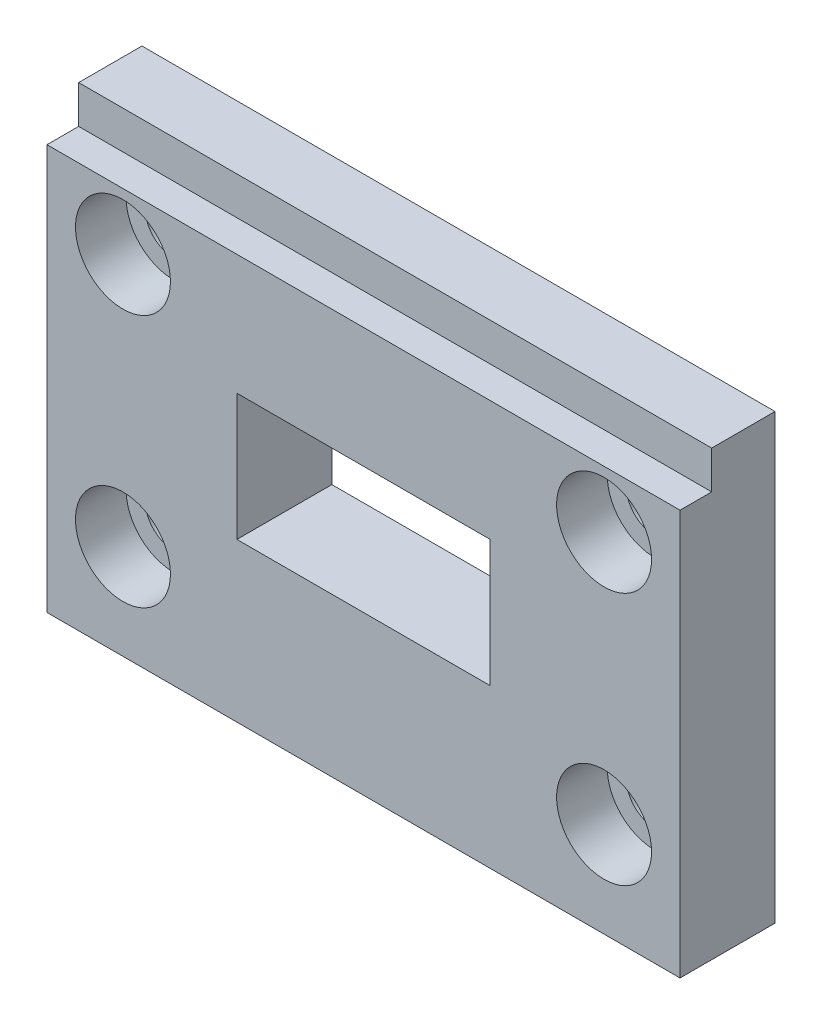
ISO-10303-21;
HEADER;
FILE_DESCRIPTION(('STEP AP214'),'2;1');
FILE_NAME('part.step','',(''),(''),'','','');
FILE_SCHEMA(('AUTOMOTIVE_DESIGN { 1 0 10303 214 1 1 1 1 }'));
ENDSEC;
DATA;
#1=APPLICATION_CONTEXT('core data for automotive mechanical design processes');
#2=APPLICATION_PROTOCOL_DEFINITION('international standard','automotive_design',2000,#1);
#3=PRODUCT_CONTEXT('',#1,'mechanical');
#4=PRODUCT('Part','Part','',(#3));
#5=PRODUCT_RELATED_PRODUCT_CATEGORY('part','',(#4));
#6=PRODUCT_DEFINITION_FORMATION('','',#4);
#7=PRODUCT_DEFINITION_CONTEXT('part definition',#1,'design');
#8=PRODUCT_DEFINITION('design','',#6,#7);
#9=PRODUCT_DEFINITION_SHAPE('','',#8);
#10=(LENGTH_UNIT() NAMED_UNIT(*) SI_UNIT(.MILLI.,.METRE.));
#11=(NAMED_UNIT(*) PLANE_ANGLE_UNIT() SI_UNIT($,.RADIAN.));
#12=(NAMED_UNIT(*) SI_UNIT($,.STERADIAN.) SOLID_ANGLE_UNIT());
#13=UNCERTAINTY_MEASURE_WITH_UNIT(LENGTH_MEASURE(1.E-05),#10,'distance_accuracy_value','');
#14=(GEOMETRIC_REPRESENTATION_CONTEXT(3) GLOBAL_UNCERTAINTY_ASSIGNED_CONTEXT((#13)) GLOBAL_UNIT_ASSIGNED_CONTEXT((#10,
#11,#12)) REPRESENTATION_CONTEXT('',''));
#15=CARTESIAN_POINT('',(0.,0.,0.));
#16=DIRECTION('',(0.,0.,1.));
#17=DIRECTION('',(1.,0.,0.));
#18=AXIS2_PLACEMENT_3D('',#15,#16,#17);
#19=CARTESIAN_POINT('',(0.,0.,15.));
#20=DIRECTION('',(0.,0.,1.));
#21=DIRECTION('',(1.,0.,0.));
#22=AXIS2_PLACEMENT_3D('',#19,#20,#21);
#23=PLANE('',#22);
#24=CARTESIAN_POINT('',(-38.,20.,15.));
#25=DIRECTION('',(0.,0.,1.));
#26=DIRECTION('',(1.,0.,0.));
#27=AXIS2_PLACEMENT_3D('',#24,#25,#26);
#28=CIRCLE('',#27,7.5);
#29=CARTESIAN_POINT('',(-30.5,20.,15.));
#30=VERTEX_POINT('',#29);
#31=EDGE_CURVE('E270',#30,#30,#28,.T.);
#32=ORIENTED_EDGE('',*,*,#31,.F.);
#33=EDGE_LOOP('',(#32));
#34=FACE_BOUND('',#33,.T.);
#35=CARTESIAN_POINT('',(38.,-20.,15.));
#36=DIRECTION('',(0.,0.,1.));
#37=DIRECTION('',(1.,0.,0.));
#38=AXIS2_PLACEMENT_3D('',#35,#36,#37);
#39=CIRCLE('',#38,7.5);
#40=CARTESIAN_POINT('',(45.5,-20.,15.));
#41=VERTEX_POINT('',#40);
#42=EDGE_CURVE('E279',#41,#41,#39,.T.);
#43=ORIENTED_EDGE('',*,*,#42,.F.);
#44=EDGE_LOOP('',(#43));
#45=FACE_BOUND('',#44,.T.);
#46=CARTESIAN_POINT('',(-38.,-20.,15.));
#47=DIRECTION('',(0.,0.,1.));
#48=DIRECTION('',(1.,0.,0.));
#49=AXIS2_PLACEMENT_3D('',#46,#47,#48);
#50=CIRCLE('',#49,7.5);
#51=CARTESIAN_POINT('',(-30.5,-20.,15.));
#52=VERTEX_POINT('',#51);
#53=EDGE_CURVE('E260',#52,#52,#50,.T.);
#54=ORIENTED_EDGE('',*,*,#53,.F.);
#55=EDGE_LOOP('',(#54));
#56=FACE_BOUND('',#55,.T.);
#57=CARTESIAN_POINT('',(38.,20.,15.));
#58=DIRECTION('',(0.,0.,1.));
#59=DIRECTION('',(1.,0.,0.));
#60=AXIS2_PLACEMENT_3D('',#57,#58,#59);
#61=CIRCLE('',#60,7.5);
#62=CARTESIAN_POINT('',(45.5,20.,15.));
#63=VERTEX_POINT('',#62);
#64=EDGE_CURVE('E274',#63,#63,#61,.T.);
#65=ORIENTED_EDGE('',*,*,#64,.F.);
#66=EDGE_LOOP('',(#65));
#67=FACE_BOUND('',#66,.T.);
#68=DIRECTION('',(1.,0.,0.));
#69=VECTOR('',#68,1.);
#70=CARTESIAN_POINT('',(-50.,29.,15.));
#71=LINE('',#70,#69);
#72=CARTESIAN_POINT('',(-50.,29.,15.));
#73=VERTEX_POINT('',#72);
#74=CARTESIAN_POINT('',(50.,29.,15.));
#75=VERTEX_POINT('',#74);
#76=EDGE_CURVE('E150',#73,#75,#71,.T.);
#77=ORIENTED_EDGE('',*,*,#76,.F.);
#78=DIRECTION('',(0.,-1.,0.));
#79=VECTOR('',#78,1.);
#80=CARTESIAN_POINT('',(-50.,35.,15.));
#81=LINE('',#80,#79);
#82=CARTESIAN_POINT('',(-50.,-35.,15.));
#83=VERTEX_POINT('',#82);
#84=EDGE_CURVE('E207',#73,#83,#81,.T.);
#85=ORIENTED_EDGE('',*,*,#84,.T.);
#86=DIRECTION('',(1.,0.,0.));
#87=VECTOR('',#86,1.);
#88=CARTESIAN_POINT('',(-50.,-35.,15.));
#89=LINE('',#88,#87);
#90=CARTESIAN_POINT('',(50.,-35.,15.));
#91=VERTEX_POINT('',#90);
#92=EDGE_CURVE('E210',#83,#91,#89,.T.);
#93=ORIENTED_EDGE('',*,*,#92,.T.);
#94=DIRECTION('',(0.,1.,0.));
#95=VECTOR('',#94,1.);
#96=CARTESIAN_POINT('',(50.,-35.,15.));
#97=LINE('',#96,#95);
#98=EDGE_CURVE('E214',#91,#75,#97,.T.);
#99=ORIENTED_EDGE('',*,*,#98,.T.);
#100=EDGE_LOOP('',(#77,#85,#93,#99));
#101=FACE_BOUND('',#100,.T.);
#102=DIRECTION('',(1.,0.,0.));
#103=VECTOR('',#102,1.);
#104=CARTESIAN_POINT('',(-20.,-10.,15.));
#105=LINE('',#104,#103);
#106=CARTESIAN_POINT('',(-20.,-10.,15.));
#107=VERTEX_POINT('',#106);
#108=CARTESIAN_POINT('',(20.,-10.,15.));
#109=VERTEX_POINT('',#108);
#110=EDGE_CURVE('E141',#107,#109,#105,.T.);
#111=ORIENTED_EDGE('',*,*,#110,.F.);
#112=DIRECTION('',(0.,-1.,0.));
#113=VECTOR('',#112,1.);
#114=CARTESIAN_POINT('',(-20.,10.,15.));
#115=LINE('',#114,#113);
#116=CARTESIAN_POINT('',(-20.,10.,15.));
#117=VERTEX_POINT('',#116);
#118=EDGE_CURVE('E132',#117,#107,#115,.T.);
#119=ORIENTED_EDGE('',*,*,#118,.F.);
#120=DIRECTION('',(-1.,0.,0.));
#121=VECTOR('',#120,1.);
#122=CARTESIAN_POINT('',(20.,10.,15.));
#123=LINE('',#122,#121);
#124=CARTESIAN_POINT('',(20.,10.,15.));
#125=VERTEX_POINT('',#124);
#126=EDGE_CURVE('E160',#125,#117,#123,.T.);
#127=ORIENTED_EDGE('',*,*,#126,.F.);
#128=DIRECTION('',(0.,1.,0.));
#129=VECTOR('',#128,1.);
#130=CARTESIAN_POINT('',(20.,-10.,15.));
#131=LINE('',#130,#129);
#132=EDGE_CURVE('E154',#109,#125,#131,.T.);
#133=ORIENTED_EDGE('',*,*,#132,.F.);
#134=EDGE_LOOP('',(#111,#119,#127,#133));
#135=FACE_BOUND('',#134,.T.);
#136=ADVANCED_FACE('F51',(#34,#45,#56,#67,#101,#135),#23,.T.);
#137=CARTESIAN_POINT('',(0.,0.,0.));
#138=DIRECTION('',(0.,0.,1.));
#139=DIRECTION('',(1.,0.,0.));
#140=AXIS2_PLACEMENT_3D('',#137,#138,#139);
#141=PLANE('',#140);
#142=CARTESIAN_POINT('',(-38.,20.,0.));
#143=DIRECTION('',(0.,0.,1.));
#144=DIRECTION('',(1.,0.,0.));
#145=AXIS2_PLACEMENT_3D('',#142,#143,#144);
#146=CIRCLE('',#145,4.5);
#147=CARTESIAN_POINT('',(-33.5,20.,0.));
#148=VERTEX_POINT('',#147);
#149=EDGE_CURVE('E616',#148,#148,#146,.T.);
#150=ORIENTED_EDGE('',*,*,#149,.T.);
#151=EDGE_LOOP('',(#150));
#152=FACE_BOUND('',#151,.T.);
#153=CARTESIAN_POINT('',(38.,-20.,0.));
#154=DIRECTION('',(0.,0.,1.));
#155=DIRECTION('',(1.,0.,0.));
#156=AXIS2_PLACEMENT_3D('',#153,#154,#155);
#157=CIRCLE('',#156,4.5);
#158=CARTESIAN_POINT('',(42.5,-20.,0.));
#159=VERTEX_POINT('',#158);
#160=EDGE_CURVE('E620',#159,#159,#157,.T.);
#161=ORIENTED_EDGE('',*,*,#160,.T.);
#162=EDGE_LOOP('',(#161));
#163=FACE_BOUND('',#162,.T.);
#164=CARTESIAN_POINT('',(-38.,-20.,0.));
#165=DIRECTION('',(0.,0.,1.));
#166=DIRECTION('',(1.,0.,0.));
#167=AXIS2_PLACEMENT_3D('',#164,#165,#166);
#168=CIRCLE('',#167,4.5);
#169=CARTESIAN_POINT('',(-33.5,-20.,0.));
#170=VERTEX_POINT('',#169);
#171=EDGE_CURVE('E624',#170,#170,#168,.T.);
#172=ORIENTED_EDGE('',*,*,#171,.T.);
#173=EDGE_LOOP('',(#172));
#174=FACE_BOUND('',#173,.T.);
#175=CARTESIAN_POINT('',(38.,20.,0.));
#176=DIRECTION('',(0.,0.,1.));
#177=DIRECTION('',(1.,0.,0.));
#178=AXIS2_PLACEMENT_3D('',#175,#176,#177);
#179=CIRCLE('',#178,4.5);
#180=CARTESIAN_POINT('',(42.5,20.,0.));
#181=VERTEX_POINT('',#180);
#182=EDGE_CURVE('E245',#181,#181,#179,.T.);
#183=ORIENTED_EDGE('',*,*,#182,.T.);
#184=EDGE_LOOP('',(#183));
#185=FACE_BOUND('',#184,.T.);
#186=DIRECTION('',(0.,-1.,0.));
#187=VECTOR('',#186,1.);
#188=CARTESIAN_POINT('',(-50.,35.,0.));
#189=LINE('',#188,#187);
#190=CARTESIAN_POINT('',(-50.,35.,0.));
#191=VERTEX_POINT('',#190);
#192=CARTESIAN_POINT('',(-50.,-35.,0.));
#193=VERTEX_POINT('',#192);
#194=EDGE_CURVE('E204',#191,#193,#189,.T.);
#195=ORIENTED_EDGE('',*,*,#194,.F.);
#196=DIRECTION('',(-1.,0.,0.));
#197=VECTOR('',#196,1.);
#198=CARTESIAN_POINT('',(50.,35.,0.));
#199=LINE('',#198,#197);
#200=CARTESIAN_POINT('',(50.,35.,0.));
#201=VERTEX_POINT('',#200);
#202=EDGE_CURVE('E211',#201,#191,#199,.T.);
#203=ORIENTED_EDGE('',*,*,#202,.F.);
#204=DIRECTION('',(0.,1.,0.));
#205=VECTOR('',#204,1.);
#206=CARTESIAN_POINT('',(50.,-35.,0.));
#207=LINE('',#206,#205);
#208=CARTESIAN_POINT('',(50.,-35.,0.));
#209=VERTEX_POINT('',#208);
#210=EDGE_CURVE('E225',#209,#201,#207,.T.);
#211=ORIENTED_EDGE('',*,*,#210,.F.);
#212=DIRECTION('',(1.,0.,0.));
#213=VECTOR('',#212,1.);
#214=CARTESIAN_POINT('',(-50.,-35.,0.));
#215=LINE('',#214,#213);
#216=EDGE_CURVE('E222',#193,#209,#215,.T.);
#217=ORIENTED_EDGE('',*,*,#216,.F.);
#218=EDGE_LOOP('',(#195,#203,#211,#217));
#219=FACE_BOUND('',#218,.T.);
#220=DIRECTION('',(0.,-1.,0.));
#221=VECTOR('',#220,1.);
#222=CARTESIAN_POINT('',(-20.,10.,0.));
#223=LINE('',#222,#221);
#224=CARTESIAN_POINT('',(-20.,10.,0.));
#225=VERTEX_POINT('',#224);
#226=CARTESIAN_POINT('',(-20.,-10.,0.));
#227=VERTEX_POINT('',#226);
#228=EDGE_CURVE('E78',#225,#227,#223,.T.);
#229=ORIENTED_EDGE('',*,*,#228,.T.);
#230=DIRECTION('',(1.,0.,0.));
#231=VECTOR('',#230,1.);
#232=CARTESIAN_POINT('',(-20.,-10.,0.));
#233=LINE('',#232,#231);
#234=CARTESIAN_POINT('',(20.,-10.,0.));
#235=VERTEX_POINT('',#234);
#236=EDGE_CURVE('E148',#227,#235,#233,.T.);
#237=ORIENTED_EDGE('',*,*,#236,.T.);
#238=DIRECTION('',(0.,1.,0.));
#239=VECTOR('',#238,1.);
#240=CARTESIAN_POINT('',(20.,-10.,0.));
#241=LINE('',#240,#239);
#242=CARTESIAN_POINT('',(20.,10.,0.));
#243=VERTEX_POINT('',#242);
#244=EDGE_CURVE('E171',#235,#243,#241,.T.);
#245=ORIENTED_EDGE('',*,*,#244,.T.);
#246=DIRECTION('',(-1.,0.,0.));
#247=VECTOR('',#246,1.);
#248=CARTESIAN_POINT('',(20.,10.,0.));
#249=LINE('',#248,#247);
#250=EDGE_CURVE('E142',#243,#225,#249,.T.);
#251=ORIENTED_EDGE('',*,*,#250,.T.);
#252=EDGE_LOOP('',(#229,#237,#245,#251));
#253=FACE_BOUND('',#252,.T.);
#254=ADVANCED_FACE('F295',(#152,#163,#174,#185,#219,#253),#141,.F.);
#255=CARTESIAN_POINT('',(50.,35.,15.));
#256=DIRECTION('',(0.,-1.,0.));
#257=DIRECTION('',(0.,0.,-1.));
#258=AXIS2_PLACEMENT_3D('',#255,#256,#257);
#259=PLANE('',#258);
#260=DIRECTION('',(-1.,0.,0.));
#261=VECTOR('',#260,1.);
#262=CARTESIAN_POINT('',(50.,35.,10.));
#263=LINE('',#262,#261);
#264=CARTESIAN_POINT('',(50.,35.,10.));
#265=VERTEX_POINT('',#264);
#266=CARTESIAN_POINT('',(-50.,35.,10.));
#267=VERTEX_POINT('',#266);
#268=EDGE_CURVE('E194',#265,#267,#263,.T.);
#269=ORIENTED_EDGE('',*,*,#268,.F.);
#270=DIRECTION('',(0.,0.,-1.));
#271=VECTOR('',#270,1.);
#272=CARTESIAN_POINT('',(50.,35.,15.));
#273=LINE('',#272,#271);
#274=EDGE_CURVE('E234',#265,#201,#273,.T.);
#275=ORIENTED_EDGE('',*,*,#274,.T.);
#276=ORIENTED_EDGE('',*,*,#202,.T.);
#277=DIRECTION('',(0.,0.,-1.));
#278=VECTOR('',#277,1.);
#279=CARTESIAN_POINT('',(-50.,35.,15.));
#280=LINE('',#279,#278);
#281=EDGE_CURVE('E218',#267,#191,#280,.T.);
#282=ORIENTED_EDGE('',*,*,#281,.F.);
#283=EDGE_LOOP('',(#269,#275,#276,#282));
#284=FACE_BOUND('',#283,.T.);
#285=ADVANCED_FACE('F322',(#284),#259,.F.);
#286=CARTESIAN_POINT('',(-50.,35.,15.));
#287=DIRECTION('',(1.,0.,0.));
#288=DIRECTION('',(0.,0.,-1.));
#289=AXIS2_PLACEMENT_3D('',#286,#287,#288);
#290=PLANE('',#289);
#291=ORIENTED_EDGE('',*,*,#84,.F.);
#292=DIRECTION('',(0.,0.,1.));
#293=VECTOR('',#292,1.);
#294=CARTESIAN_POINT('',(-50.,29.,10.));
#295=LINE('',#294,#293);
#296=CARTESIAN_POINT('',(-50.,29.,10.));
#297=VERTEX_POINT('',#296);
#298=EDGE_CURVE('E197',#297,#73,#295,.T.);
#299=ORIENTED_EDGE('',*,*,#298,.F.);
#300=DIRECTION('',(0.,-1.,0.));
#301=VECTOR('',#300,1.);
#302=CARTESIAN_POINT('',(-50.,35.,10.));
#303=LINE('',#302,#301);
#304=EDGE_CURVE('E183',#267,#297,#303,.T.);
#305=ORIENTED_EDGE('',*,*,#304,.F.);
#306=ORIENTED_EDGE('',*,*,#281,.T.);
#307=ORIENTED_EDGE('',*,*,#194,.T.);
#308=DIRECTION('',(0.,0.,-1.));
#309=VECTOR('',#308,1.);
#310=CARTESIAN_POINT('',(-50.,-35.,15.));
#311=LINE('',#310,#309);
#312=EDGE_CURVE('E11',#83,#193,#311,.T.);
#313=ORIENTED_EDGE('',*,*,#312,.F.);
#314=EDGE_LOOP('',(#291,#299,#305,#306,#307,#313));
#315=FACE_BOUND('',#314,.T.);
#316=ADVANCED_FACE('F54',(#315),#290,.F.);
#317=CARTESIAN_POINT('',(-50.,-35.,15.));
#318=DIRECTION('',(0.,1.,0.));
#319=DIRECTION('',(0.,0.,1.));
#320=AXIS2_PLACEMENT_3D('',#317,#318,#319);
#321=PLANE('',#320);
#322=ORIENTED_EDGE('',*,*,#216,.T.);
#323=DIRECTION('',(0.,0.,-1.));
#324=VECTOR('',#323,1.);
#325=CARTESIAN_POINT('',(50.,-35.,15.));
#326=LINE('',#325,#324);
#327=EDGE_CURVE('E62',#91,#209,#326,.T.);
#328=ORIENTED_EDGE('',*,*,#327,.F.);
#329=ORIENTED_EDGE('',*,*,#92,.F.);
#330=ORIENTED_EDGE('',*,*,#312,.T.);
#331=EDGE_LOOP('',(#322,#328,#329,#330));
#332=FACE_BOUND('',#331,.T.);
#333=ADVANCED_FACE('F309',(#332),#321,.F.);
#334=CARTESIAN_POINT('',(50.,-35.,15.));
#335=DIRECTION('',(-1.,0.,0.));
#336=DIRECTION('',(0.,0.,1.));
#337=AXIS2_PLACEMENT_3D('',#334,#335,#336);
#338=PLANE('',#337);
#339=DIRECTION('',(0.,1.,0.));
#340=VECTOR('',#339,1.);
#341=CARTESIAN_POINT('',(50.,29.,10.));
#342=LINE('',#341,#340);
#343=CARTESIAN_POINT('',(50.,29.,10.));
#344=VERTEX_POINT('',#343);
#345=EDGE_CURVE('E191',#344,#265,#342,.T.);
#346=ORIENTED_EDGE('',*,*,#345,.F.);
#347=DIRECTION('',(0.,0.,1.));
#348=VECTOR('',#347,1.);
#349=CARTESIAN_POINT('',(50.,29.,10.));
#350=LINE('',#349,#348);
#351=EDGE_CURVE('E200',#344,#75,#350,.T.);
#352=ORIENTED_EDGE('',*,*,#351,.T.);
#353=ORIENTED_EDGE('',*,*,#98,.F.);
#354=ORIENTED_EDGE('',*,*,#327,.T.);
#355=ORIENTED_EDGE('',*,*,#210,.T.);
#356=ORIENTED_EDGE('',*,*,#274,.F.);
#357=EDGE_LOOP('',(#346,#352,#353,#354,#355,#356));
#358=FACE_BOUND('',#357,.T.);
#359=ADVANCED_FACE('F314',(#358),#338,.F.);
#360=CARTESIAN_POINT('',(-50.,29.,10.));
#361=DIRECTION('',(0.,-1.,0.));
#362=DIRECTION('',(0.,0.,-1.));
#363=AXIS2_PLACEMENT_3D('',#360,#361,#362);
#364=PLANE('',#363);
#365=ORIENTED_EDGE('',*,*,#76,.T.);
#366=ORIENTED_EDGE('',*,*,#351,.F.);
#367=DIRECTION('',(1.,0.,0.));
#368=VECTOR('',#367,1.);
#369=CARTESIAN_POINT('',(-50.,29.,10.));
#370=LINE('',#369,#368);
#371=EDGE_CURVE('E187',#297,#344,#370,.T.);
#372=ORIENTED_EDGE('',*,*,#371,.F.);
#373=ORIENTED_EDGE('',*,*,#298,.T.);
#374=EDGE_LOOP('',(#365,#366,#372,#373));
#375=FACE_BOUND('',#374,.T.);
#376=ADVANCED_FACE('F316',(#375),#364,.F.);
#377=CARTESIAN_POINT('',(0.,0.,10.));
#378=DIRECTION('',(0.,0.,1.));
#379=DIRECTION('',(1.,0.,0.));
#380=AXIS2_PLACEMENT_3D('',#377,#378,#379);
#381=PLANE('',#380);
#382=ORIENTED_EDGE('',*,*,#304,.T.);
#383=ORIENTED_EDGE('',*,*,#371,.T.);
#384=ORIENTED_EDGE('',*,*,#345,.T.);
#385=ORIENTED_EDGE('',*,*,#268,.T.);
#386=EDGE_LOOP('',(#382,#383,#384,#385));
#387=FACE_BOUND('',#386,.T.);
#388=ADVANCED_FACE('F318',(#387),#381,.T.);
#389=CARTESIAN_POINT('',(-20.,10.,15.));
#390=DIRECTION('',(1.,0.,0.));
#391=DIRECTION('',(0.,0.,-1.));
#392=AXIS2_PLACEMENT_3D('',#389,#390,#391);
#393=PLANE('',#392);
#394=ORIENTED_EDGE('',*,*,#228,.F.);
#395=DIRECTION('',(0.,0.,-1.));
#396=VECTOR('',#395,1.);
#397=CARTESIAN_POINT('',(-20.,10.,15.));
#398=LINE('',#397,#396);
#399=EDGE_CURVE('E136',#117,#225,#398,.T.);
#400=ORIENTED_EDGE('',*,*,#399,.F.);
#401=ORIENTED_EDGE('',*,*,#118,.T.);
#402=DIRECTION('',(0.,0.,-1.));
#403=VECTOR('',#402,1.);
#404=CARTESIAN_POINT('',(-20.,-10.,15.));
#405=LINE('',#404,#403);
#406=EDGE_CURVE('E135',#107,#227,#405,.T.);
#407=ORIENTED_EDGE('',*,*,#406,.T.);
#408=EDGE_LOOP('',(#394,#400,#401,#407));
#409=FACE_BOUND('',#408,.T.);
#410=ADVANCED_FACE('F134',(#409),#393,.T.);
#411=CARTESIAN_POINT('',(-20.,-10.,15.));
#412=DIRECTION('',(0.,1.,0.));
#413=DIRECTION('',(0.,0.,1.));
#414=AXIS2_PLACEMENT_3D('',#411,#412,#413);
#415=PLANE('',#414);
#416=ORIENTED_EDGE('',*,*,#236,.F.);
#417=ORIENTED_EDGE('',*,*,#406,.F.);
#418=ORIENTED_EDGE('',*,*,#110,.T.);
#419=DIRECTION('',(0.,0.,-1.));
#420=VECTOR('',#419,1.);
#421=CARTESIAN_POINT('',(20.,-10.,15.));
#422=LINE('',#421,#420);
#423=EDGE_CURVE('E151',#109,#235,#422,.T.);
#424=ORIENTED_EDGE('',*,*,#423,.T.);
#425=EDGE_LOOP('',(#416,#417,#418,#424));
#426=FACE_BOUND('',#425,.T.);
#427=ADVANCED_FACE('F145',(#426),#415,.T.);
#428=CARTESIAN_POINT('',(20.,-10.,15.));
#429=DIRECTION('',(-1.,0.,0.));
#430=DIRECTION('',(0.,0.,1.));
#431=AXIS2_PLACEMENT_3D('',#428,#429,#430);
#432=PLANE('',#431);
#433=ORIENTED_EDGE('',*,*,#244,.F.);
#434=ORIENTED_EDGE('',*,*,#423,.F.);
#435=ORIENTED_EDGE('',*,*,#132,.T.);
#436=DIRECTION('',(0.,0.,-1.));
#437=VECTOR('',#436,1.);
#438=CARTESIAN_POINT('',(20.,10.,15.));
#439=LINE('',#438,#437);
#440=EDGE_CURVE('E70',#125,#243,#439,.T.);
#441=ORIENTED_EDGE('',*,*,#440,.T.);
#442=EDGE_LOOP('',(#433,#434,#435,#441));
#443=FACE_BOUND('',#442,.T.);
#444=ADVANCED_FACE('F332',(#443),#432,.T.);
#445=CARTESIAN_POINT('',(20.,10.,15.));
#446=DIRECTION('',(0.,-1.,0.));
#447=DIRECTION('',(0.,0.,-1.));
#448=AXIS2_PLACEMENT_3D('',#445,#446,#447);
#449=PLANE('',#448);
#450=ORIENTED_EDGE('',*,*,#250,.F.);
#451=ORIENTED_EDGE('',*,*,#440,.F.);
#452=ORIENTED_EDGE('',*,*,#126,.T.);
#453=ORIENTED_EDGE('',*,*,#399,.T.);
#454=EDGE_LOOP('',(#450,#451,#452,#453));
#455=FACE_BOUND('',#454,.T.);
#456=ADVANCED_FACE('F330',(#455),#449,.T.);
#457=CARTESIAN_POINT('',(38.,20.,7.));
#458=DIRECTION('',(0.,0.,1.));
#459=DIRECTION('',(1.,0.,0.));
#460=AXIS2_PLACEMENT_3D('',#457,#458,#459);
#461=CYLINDRICAL_SURFACE('',#460,7.5);
#462=CARTESIAN_POINT('',(38.,20.,7.));
#463=DIRECTION('',(0.,0.,1.));
#464=DIRECTION('',(1.,0.,0.));
#465=AXIS2_PLACEMENT_3D('',#462,#463,#464);
#466=CIRCLE('',#465,7.5);
#467=CARTESIAN_POINT('',(45.5,20.,7.));
#468=VERTEX_POINT('',#467);
#469=EDGE_CURVE('E168',#468,#468,#466,.T.);
#470=ORIENTED_EDGE('',*,*,#469,.F.);
#471=EDGE_LOOP('',(#470));
#472=FACE_BOUND('',#471,.T.);
#473=ORIENTED_EDGE('',*,*,#64,.T.);
#474=EDGE_LOOP('',(#473));
#475=FACE_BOUND('',#474,.T.);
#476=ADVANCED_FACE('F291',(#472,#475),#461,.F.);
#477=CARTESIAN_POINT('',(38.,20.,7.));
#478=DIRECTION('',(0.,0.,1.));
#479=DIRECTION('',(1.,0.,0.));
#480=AXIS2_PLACEMENT_3D('',#477,#478,#479);
#481=PLANE('',#480);
#482=CARTESIAN_POINT('',(38.,20.,7.));
#483=DIRECTION('',(0.,0.,1.));
#484=DIRECTION('',(1.,0.,0.));
#485=AXIS2_PLACEMENT_3D('',#482,#483,#484);
#486=CIRCLE('',#485,4.5);
#487=CARTESIAN_POINT('',(42.5,20.,7.));
#488=VERTEX_POINT('',#487);
#489=EDGE_CURVE('E56',#488,#488,#486,.T.);
#490=ORIENTED_EDGE('',*,*,#489,.F.);
#491=EDGE_LOOP('',(#490));
#492=FACE_BOUND('',#491,.T.);
#493=ORIENTED_EDGE('',*,*,#469,.T.);
#494=EDGE_LOOP('',(#493));
#495=FACE_BOUND('',#494,.T.);
#496=ADVANCED_FACE('F337',(#492,#495),#481,.T.);
#497=CARTESIAN_POINT('',(-38.,-20.,7.));
#498=DIRECTION('',(0.,0.,1.));
#499=DIRECTION('',(1.,0.,0.));
#500=AXIS2_PLACEMENT_3D('',#497,#498,#499);
#501=CYLINDRICAL_SURFACE('',#500,7.5);
#502=CARTESIAN_POINT('',(-38.,-20.,7.));
#503=DIRECTION('',(0.,0.,1.));
#504=DIRECTION('',(1.,0.,0.));
#505=AXIS2_PLACEMENT_3D('',#502,#503,#504);
#506=CIRCLE('',#505,7.5);
#507=CARTESIAN_POINT('',(-30.5,-20.,7.));
#508=VERTEX_POINT('',#507);
#509=EDGE_CURVE('E255',#508,#508,#506,.T.);
#510=ORIENTED_EDGE('',*,*,#509,.F.);
#511=EDGE_LOOP('',(#510));
#512=FACE_BOUND('',#511,.T.);
#513=ORIENTED_EDGE('',*,*,#53,.T.);
#514=EDGE_LOOP('',(#513));
#515=FACE_BOUND('',#514,.T.);
#516=ADVANCED_FACE('F398',(#512,#515),#501,.F.);
#517=CARTESIAN_POINT('',(-38.,-20.,7.));
#518=DIRECTION('',(0.,0.,1.));
#519=DIRECTION('',(1.,0.,0.));
#520=AXIS2_PLACEMENT_3D('',#517,#518,#519);
#521=PLANE('',#520);
#522=CARTESIAN_POINT('',(-38.,-20.,7.));
#523=DIRECTION('',(0.,0.,1.));
#524=DIRECTION('',(1.,0.,0.));
#525=AXIS2_PLACEMENT_3D('',#522,#523,#524);
#526=CIRCLE('',#525,4.5);
#527=CARTESIAN_POINT('',(-33.5,-20.,7.));
#528=VERTEX_POINT('',#527);
#529=EDGE_CURVE('E248',#528,#528,#526,.T.);
#530=ORIENTED_EDGE('',*,*,#529,.F.);
#531=EDGE_LOOP('',(#530));
#532=FACE_BOUND('',#531,.T.);
#533=ORIENTED_EDGE('',*,*,#509,.T.);
#534=EDGE_LOOP('',(#533));
#535=FACE_BOUND('',#534,.T.);
#536=ADVANCED_FACE('F404',(#532,#535),#521,.T.);
#537=CARTESIAN_POINT('',(38.,-20.,7.));
#538=DIRECTION('',(0.,0.,1.));
#539=DIRECTION('',(1.,0.,0.));
#540=AXIS2_PLACEMENT_3D('',#537,#538,#539);
#541=CYLINDRICAL_SURFACE('',#540,7.5);
#542=CARTESIAN_POINT('',(38.,-20.,7.));
#543=DIRECTION('',(0.,0.,1.));
#544=DIRECTION('',(1.,0.,0.));
#545=AXIS2_PLACEMENT_3D('',#542,#543,#544);
#546=CIRCLE('',#545,7.5);
#547=CARTESIAN_POINT('',(45.5,-20.,7.));
#548=VERTEX_POINT('',#547);
#549=EDGE_CURVE('E266',#548,#548,#546,.T.);
#550=ORIENTED_EDGE('',*,*,#549,.F.);
#551=EDGE_LOOP('',(#550));
#552=FACE_BOUND('',#551,.T.);
#553=ORIENTED_EDGE('',*,*,#42,.T.);
#554=EDGE_LOOP('',(#553));
#555=FACE_BOUND('',#554,.T.);
#556=ADVANCED_FACE('F412',(#552,#555),#541,.F.);
#557=CARTESIAN_POINT('',(38.,-20.,7.));
#558=DIRECTION('',(0.,0.,1.));
#559=DIRECTION('',(1.,0.,0.));
#560=AXIS2_PLACEMENT_3D('',#557,#558,#559);
#561=PLANE('',#560);
#562=CARTESIAN_POINT('',(38.,-20.,7.));
#563=DIRECTION('',(0.,0.,1.));
#564=DIRECTION('',(1.,0.,0.));
#565=AXIS2_PLACEMENT_3D('',#562,#563,#564);
#566=CIRCLE('',#565,4.5);
#567=CARTESIAN_POINT('',(42.5,-20.,7.));
#568=VERTEX_POINT('',#567);
#569=EDGE_CURVE('E244',#568,#568,#566,.T.);
#570=ORIENTED_EDGE('',*,*,#569,.F.);
#571=EDGE_LOOP('',(#570));
#572=FACE_BOUND('',#571,.T.);
#573=ORIENTED_EDGE('',*,*,#549,.T.);
#574=EDGE_LOOP('',(#573));
#575=FACE_BOUND('',#574,.T.);
#576=ADVANCED_FACE('F418',(#572,#575),#561,.T.);
#577=CARTESIAN_POINT('',(-38.,20.,7.));
#578=DIRECTION('',(0.,0.,1.));
#579=DIRECTION('',(1.,0.,0.));
#580=AXIS2_PLACEMENT_3D('',#577,#578,#579);
#581=CYLINDRICAL_SURFACE('',#580,7.5);
#582=CARTESIAN_POINT('',(-38.,20.,7.));
#583=DIRECTION('',(0.,0.,1.));
#584=DIRECTION('',(1.,0.,0.));
#585=AXIS2_PLACEMENT_3D('',#582,#583,#584);
#586=CIRCLE('',#585,7.5);
#587=CARTESIAN_POINT('',(-30.5,20.,7.));
#588=VERTEX_POINT('',#587);
#589=EDGE_CURVE('E275',#588,#588,#586,.T.);
#590=ORIENTED_EDGE('',*,*,#589,.F.);
#591=EDGE_LOOP('',(#590));
#592=FACE_BOUND('',#591,.T.);
#593=ORIENTED_EDGE('',*,*,#31,.T.);
#594=EDGE_LOOP('',(#593));
#595=FACE_BOUND('',#594,.T.);
#596=ADVANCED_FACE('F426',(#592,#595),#581,.F.);
#597=CARTESIAN_POINT('',(-38.,20.,7.));
#598=DIRECTION('',(0.,0.,1.));
#599=DIRECTION('',(1.,0.,0.));
#600=AXIS2_PLACEMENT_3D('',#597,#598,#599);
#601=PLANE('',#600);
#602=CARTESIAN_POINT('',(-38.,20.,7.));
#603=DIRECTION('',(0.,0.,1.));
#604=DIRECTION('',(1.,0.,0.));
#605=AXIS2_PLACEMENT_3D('',#602,#603,#604);
#606=CIRCLE('',#605,4.5);
#607=CARTESIAN_POINT('',(-33.5,20.,7.));
#608=VERTEX_POINT('',#607);
#609=EDGE_CURVE('E240',#608,#608,#606,.T.);
#610=ORIENTED_EDGE('',*,*,#609,.F.);
#611=EDGE_LOOP('',(#610));
#612=FACE_BOUND('',#611,.T.);
#613=ORIENTED_EDGE('',*,*,#589,.T.);
#614=EDGE_LOOP('',(#613));
#615=FACE_BOUND('',#614,.T.);
#616=ADVANCED_FACE('F431',(#612,#615),#601,.T.);
#617=CARTESIAN_POINT('',(-38.,20.,0.));
#618=DIRECTION('',(0.,0.,1.));
#619=DIRECTION('',(1.,0.,0.));
#620=AXIS2_PLACEMENT_3D('',#617,#618,#619);
#621=CYLINDRICAL_SURFACE('',#620,4.5);
#622=ORIENTED_EDGE('',*,*,#609,.T.);
#623=EDGE_LOOP('',(#622));
#624=FACE_BOUND('',#623,.T.);
#625=ORIENTED_EDGE('',*,*,#149,.F.);
#626=EDGE_LOOP('',(#625));
#627=FACE_BOUND('',#626,.T.);
#628=ADVANCED_FACE('F470',(#624,#627),#621,.F.);
#629=CARTESIAN_POINT('',(38.,-20.,0.));
#630=DIRECTION('',(0.,0.,1.));
#631=DIRECTION('',(1.,0.,0.));
#632=AXIS2_PLACEMENT_3D('',#629,#630,#631);
#633=CYLINDRICAL_SURFACE('',#632,4.5);
#634=ORIENTED_EDGE('',*,*,#569,.T.);
#635=EDGE_LOOP('',(#634));
#636=FACE_BOUND('',#635,.T.);
#637=ORIENTED_EDGE('',*,*,#160,.F.);
#638=EDGE_LOOP('',(#637));
#639=FACE_BOUND('',#638,.T.);
#640=ADVANCED_FACE('F481',(#636,#639),#633,.F.);
#641=CARTESIAN_POINT('',(-38.,-20.,0.));
#642=DIRECTION('',(0.,0.,1.));
#643=DIRECTION('',(1.,0.,0.));
#644=AXIS2_PLACEMENT_3D('',#641,#642,#643);
#645=CYLINDRICAL_SURFACE('',#644,4.5);
#646=ORIENTED_EDGE('',*,*,#529,.T.);
#647=EDGE_LOOP('',(#646));
#648=FACE_BOUND('',#647,.T.);
#649=ORIENTED_EDGE('',*,*,#171,.F.);
#650=EDGE_LOOP('',(#649));
#651=FACE_BOUND('',#650,.T.);
#652=ADVANCED_FACE('F492',(#648,#651),#645,.F.);
#653=CARTESIAN_POINT('',(38.,20.,0.));
#654=DIRECTION('',(0.,0.,1.));
#655=DIRECTION('',(1.,0.,0.));
#656=AXIS2_PLACEMENT_3D('',#653,#654,#655);
#657=CYLINDRICAL_SURFACE('',#656,4.5);
#658=ORIENTED_EDGE('',*,*,#489,.T.);
#659=EDGE_LOOP('',(#658));
#660=FACE_BOUND('',#659,.T.);
#661=ORIENTED_EDGE('',*,*,#182,.F.);
#662=EDGE_LOOP('',(#661));
#663=FACE_BOUND('',#662,.T.);
#664=ADVANCED_FACE('F503',(#660,#663),#657,.F.);
#665=CLOSED_SHELL('',(#136,#254,#285,#316,#333,#359,#376,#388,#410,#427,#444,#456,#476,#496,
#516,#536,#556,#576,#596,#616,#628,#640,#652,#664));
#666=MANIFOLD_SOLID_BREP('B2',#665);
#667=ADVANCED_BREP_SHAPE_REPRESENTATION('',(#18,#666),#14);
#668=SHAPE_DEFINITION_REPRESENTATION(#9,#667);
ENDSEC;
END-ISO-10303-21;
